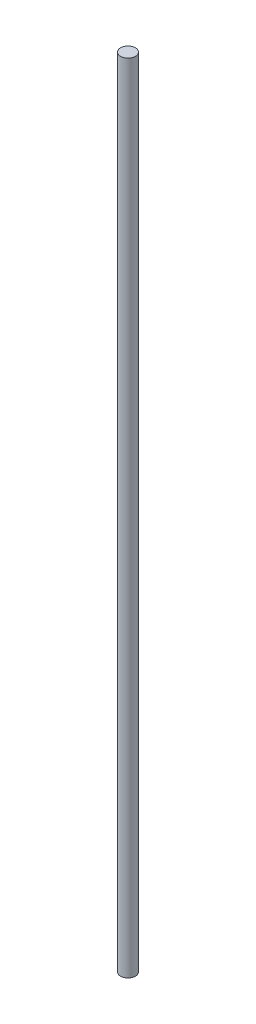
ISO-10303-21;
HEADER;
FILE_DESCRIPTION(('STEP AP214'),'2;1');
FILE_NAME('part.step','',(''),(''),'','','');
FILE_SCHEMA(('AUTOMOTIVE_DESIGN { 1 0 10303 214 1 1 1 1 }'));
ENDSEC;
DATA;
#1=APPLICATION_CONTEXT('core data for automotive mechanical design processes');
#2=APPLICATION_PROTOCOL_DEFINITION('international standard','automotive_design',2000,#1);
#3=PRODUCT_CONTEXT('',#1,'mechanical');
#4=PRODUCT('Part','Part','',(#3));
#5=PRODUCT_RELATED_PRODUCT_CATEGORY('part','',(#4));
#6=PRODUCT_DEFINITION_FORMATION('','',#4);
#7=PRODUCT_DEFINITION_CONTEXT('part definition',#1,'design');
#8=PRODUCT_DEFINITION('design','',#6,#7);
#9=PRODUCT_DEFINITION_SHAPE('','',#8);
#10=(LENGTH_UNIT() NAMED_UNIT(*) SI_UNIT(.MILLI.,.METRE.));
#11=(NAMED_UNIT(*) PLANE_ANGLE_UNIT() SI_UNIT($,.RADIAN.));
#12=(NAMED_UNIT(*) SI_UNIT($,.STERADIAN.) SOLID_ANGLE_UNIT());
#13=UNCERTAINTY_MEASURE_WITH_UNIT(LENGTH_MEASURE(1.E-05),#10,'distance_accuracy_value','');
#14=(GEOMETRIC_REPRESENTATION_CONTEXT(3) GLOBAL_UNCERTAINTY_ASSIGNED_CONTEXT((#13)) GLOBAL_UNIT_ASSIGNED_CONTEXT((#10,
#11,#12)) REPRESENTATION_CONTEXT('',''));
#15=CARTESIAN_POINT('',(0.,0.,0.));
#16=DIRECTION('',(0.,0.,1.));
#17=DIRECTION('',(1.,0.,0.));
#18=AXIS2_PLACEMENT_3D('',#15,#16,#17);
#19=CARTESIAN_POINT('',(0.,215.,0.));
#20=DIRECTION('',(0.,-1.,0.));
#21=DIRECTION('',(0.,0.,-1.));
#22=AXIS2_PLACEMENT_3D('',#19,#20,#21);
#23=CYLINDRICAL_SURFACE('',#22,4.);
#24=CARTESIAN_POINT('',(0.,215.,0.));
#25=DIRECTION('',(0.,1.,0.));
#26=DIRECTION('',(0.,0.,1.));
#27=AXIS2_PLACEMENT_3D('',#24,#25,#26);
#28=CIRCLE('',#27,4.);
#29=CARTESIAN_POINT('',(0.,215.,4.));
#30=VERTEX_POINT('',#29);
#31=EDGE_CURVE('E10',#30,#30,#28,.T.);
#32=ORIENTED_EDGE('',*,*,#31,.F.);
#33=EDGE_LOOP('',(#32));
#34=FACE_BOUND('',#33,.T.);
#35=CARTESIAN_POINT('',(0.,-215.,0.));
#36=DIRECTION('',(0.,1.,0.));
#37=DIRECTION('',(0.,0.,1.));
#38=AXIS2_PLACEMENT_3D('',#35,#36,#37);
#39=CIRCLE('',#38,4.);
#40=CARTESIAN_POINT('',(0.,-215.,4.));
#41=VERTEX_POINT('',#40);
#42=EDGE_CURVE('E46',#41,#41,#39,.T.);
#43=ORIENTED_EDGE('',*,*,#42,.T.);
#44=EDGE_LOOP('',(#43));
#45=FACE_BOUND('',#44,.T.);
#46=ADVANCED_FACE('F43',(#34,#45),#23,.T.);
#47=CARTESIAN_POINT('',(0.,215.,0.));
#48=DIRECTION('',(0.,1.,0.));
#49=DIRECTION('',(0.,0.,1.));
#50=AXIS2_PLACEMENT_3D('',#47,#48,#49);
#51=PLANE('',#50);
#52=ORIENTED_EDGE('',*,*,#31,.T.);
#53=EDGE_LOOP('',(#52));
#54=FACE_BOUND('',#53,.T.);
#55=ADVANCED_FACE('F60',(#54),#51,.T.);
#56=CARTESIAN_POINT('',(0.,-215.,0.));
#57=DIRECTION('',(0.,1.,0.));
#58=DIRECTION('',(0.,0.,1.));
#59=AXIS2_PLACEMENT_3D('',#56,#57,#58);
#60=PLANE('',#59);
#61=ORIENTED_EDGE('',*,*,#42,.F.);
#62=EDGE_LOOP('',(#61));
#63=FACE_BOUND('',#62,.T.);
#64=ADVANCED_FACE('F58',(#63),#60,.F.);
#65=CLOSED_SHELL('',(#46,#55,#64));
#66=MANIFOLD_SOLID_BREP('B2',#65);
#67=ADVANCED_BREP_SHAPE_REPRESENTATION('',(#18,#66),#14);
#68=SHAPE_DEFINITION_REPRESENTATION(#9,#67);
ENDSEC;
END-ISO-10303-21;
